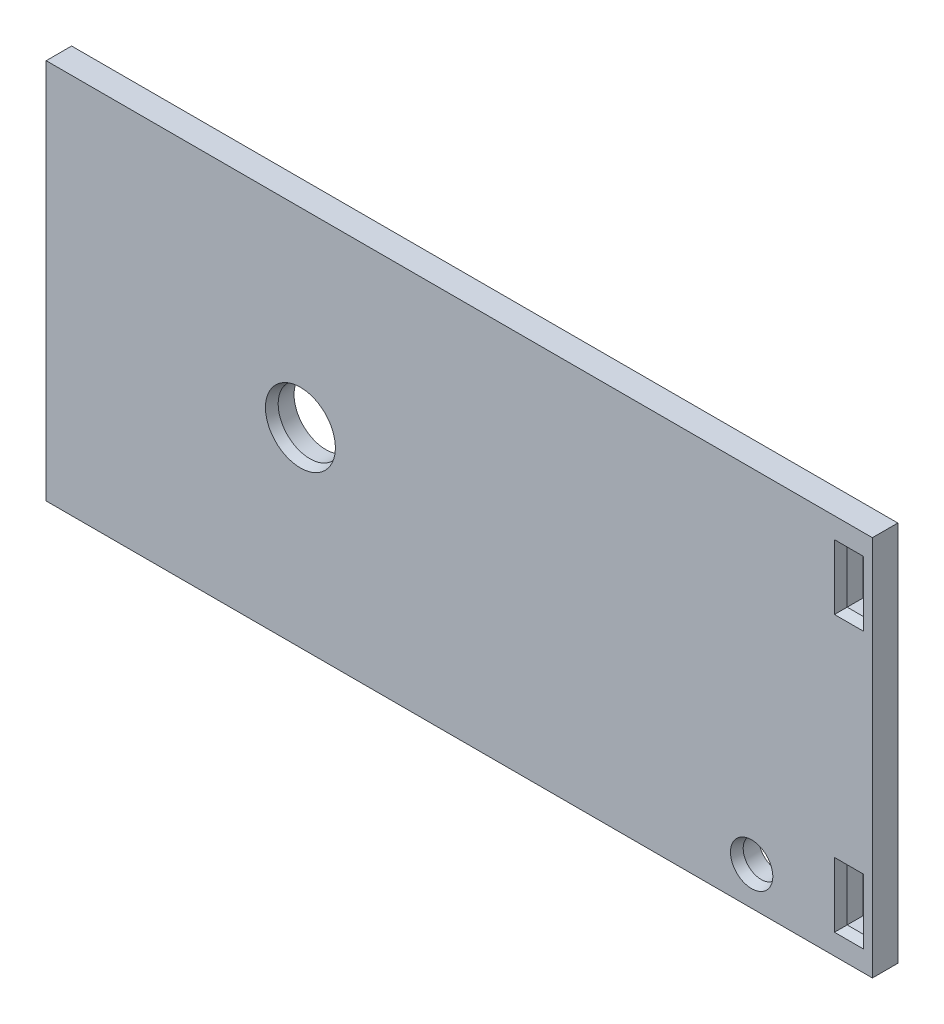
ISO-10303-21;
HEADER;
FILE_DESCRIPTION(('STEP AP214'),'2;1');
FILE_NAME('part.step','',(''),(''),'','','');
FILE_SCHEMA(('AUTOMOTIVE_DESIGN { 1 0 10303 214 1 1 1 1 }'));
ENDSEC;
DATA;
#1=APPLICATION_CONTEXT('core data for automotive mechanical design processes');
#2=APPLICATION_PROTOCOL_DEFINITION('international standard','automotive_design',2000,#1);
#3=PRODUCT_CONTEXT('',#1,'mechanical');
#4=PRODUCT('Part','Part','',(#3));
#5=PRODUCT_RELATED_PRODUCT_CATEGORY('part','',(#4));
#6=PRODUCT_DEFINITION_FORMATION('','',#4);
#7=PRODUCT_DEFINITION_CONTEXT('part definition',#1,'design');
#8=PRODUCT_DEFINITION('design','',#6,#7);
#9=PRODUCT_DEFINITION_SHAPE('','',#8);
#10=(LENGTH_UNIT() NAMED_UNIT(*) SI_UNIT(.MILLI.,.METRE.));
#11=(NAMED_UNIT(*) PLANE_ANGLE_UNIT() SI_UNIT($,.RADIAN.));
#12=(NAMED_UNIT(*) SI_UNIT($,.STERADIAN.) SOLID_ANGLE_UNIT());
#13=UNCERTAINTY_MEASURE_WITH_UNIT(LENGTH_MEASURE(1.E-05),#10,'distance_accuracy_value','');
#14=(GEOMETRIC_REPRESENTATION_CONTEXT(3) GLOBAL_UNCERTAINTY_ASSIGNED_CONTEXT((#13)) GLOBAL_UNIT_ASSIGNED_CONTEXT((#10,
#11,#12)) REPRESENTATION_CONTEXT('',''));
#15=CARTESIAN_POINT('',(0.,0.,0.));
#16=DIRECTION('',(0.,0.,1.));
#17=DIRECTION('',(1.,0.,0.));
#18=AXIS2_PLACEMENT_3D('',#15,#16,#17);
#19=CARTESIAN_POINT('',(0.,0.,2.));
#20=DIRECTION('',(0.,0.,-1.));
#21=DIRECTION('',(-1.,0.,0.));
#22=AXIS2_PLACEMENT_3D('',#19,#20,#21);
#23=PLANE('',#22);
#24=CARTESIAN_POINT('',(-25.,0.,2.));
#25=DIRECTION('',(0.,0.,-1.));
#26=DIRECTION('',(-1.,0.,0.));
#27=AXIS2_PLACEMENT_3D('',#24,#25,#26);
#28=CIRCLE('',#27,5.49999999999996);
#29=CARTESIAN_POINT('',(-30.5,0.,2.));
#30=VERTEX_POINT('',#29);
#31=EDGE_CURVE('E267',#30,#30,#28,.T.);
#32=ORIENTED_EDGE('',*,*,#31,.T.);
#33=EDGE_LOOP('',(#32));
#34=FACE_BOUND('',#33,.T.);
#35=CARTESIAN_POINT('',(46.,-24.,2.));
#36=DIRECTION('',(0.,0.,-1.));
#37=DIRECTION('',(-1.,0.,0.));
#38=AXIS2_PLACEMENT_3D('',#35,#36,#37);
#39=CIRCLE('',#38,3.33000000000002);
#40=CARTESIAN_POINT('',(42.67,-24.,2.));
#41=VERTEX_POINT('',#40);
#42=EDGE_CURVE('E264',#41,#41,#39,.T.);
#43=ORIENTED_EDGE('',*,*,#42,.T.);
#44=EDGE_LOOP('',(#43));
#45=FACE_BOUND('',#44,.T.);
#46=DIRECTION('',(0.,-1.,0.));
#47=VECTOR('',#46,1.);
#48=CARTESIAN_POINT('',(63.565,17.05,2.));
#49=LINE('',#48,#47);
#50=CARTESIAN_POINT('',(63.565,26.75,2.));
#51=VERTEX_POINT('',#50);
#52=CARTESIAN_POINT('',(63.565,16.55,2.));
#53=VERTEX_POINT('',#52);
#54=EDGE_CURVE('E255',#51,#53,#49,.T.);
#55=ORIENTED_EDGE('',*,*,#54,.T.);
#56=DIRECTION('',(-1.,0.,0.));
#57=VECTOR('',#56,1.);
#58=CARTESIAN_POINT('',(59.535,16.55,2.));
#59=LINE('',#58,#57);
#60=CARTESIAN_POINT('',(59.035,16.55,2.));
#61=VERTEX_POINT('',#60);
#62=EDGE_CURVE('E261',#53,#61,#59,.T.);
#63=ORIENTED_EDGE('',*,*,#62,.T.);
#64=DIRECTION('',(0.,1.,0.));
#65=VECTOR('',#64,1.);
#66=CARTESIAN_POINT('',(59.035,26.25,2.));
#67=LINE('',#66,#65);
#68=CARTESIAN_POINT('',(59.035,26.75,2.));
#69=VERTEX_POINT('',#68);
#70=EDGE_CURVE('E259',#61,#69,#67,.T.);
#71=ORIENTED_EDGE('',*,*,#70,.T.);
#72=DIRECTION('',(1.,0.,0.));
#73=VECTOR('',#72,1.);
#74=CARTESIAN_POINT('',(63.065,26.75,2.));
#75=LINE('',#74,#73);
#76=EDGE_CURVE('E257',#69,#51,#75,.T.);
#77=ORIENTED_EDGE('',*,*,#76,.T.);
#78=EDGE_LOOP('',(#55,#63,#71,#77));
#79=FACE_BOUND('',#78,.T.);
#80=DIRECTION('',(1.,0.,0.));
#81=VECTOR('',#80,1.);
#82=CARTESIAN_POINT('',(63.065,-16.55,2.));
#83=LINE('',#82,#81);
#84=CARTESIAN_POINT('',(59.035,-16.55,2.));
#85=VERTEX_POINT('',#84);
#86=CARTESIAN_POINT('',(63.565,-16.55,2.));
#87=VERTEX_POINT('',#86);
#88=EDGE_CURVE('E246',#85,#87,#83,.T.);
#89=ORIENTED_EDGE('',*,*,#88,.T.);
#90=DIRECTION('',(0.,-1.,0.));
#91=VECTOR('',#90,1.);
#92=CARTESIAN_POINT('',(63.565,-26.25,2.));
#93=LINE('',#92,#91);
#94=CARTESIAN_POINT('',(63.565,-26.75,2.));
#95=VERTEX_POINT('',#94);
#96=EDGE_CURVE('E252',#87,#95,#93,.T.);
#97=ORIENTED_EDGE('',*,*,#96,.T.);
#98=DIRECTION('',(-1.,0.,0.));
#99=VECTOR('',#98,1.);
#100=CARTESIAN_POINT('',(59.535,-26.75,2.));
#101=LINE('',#100,#99);
#102=CARTESIAN_POINT('',(59.035,-26.75,2.));
#103=VERTEX_POINT('',#102);
#104=EDGE_CURVE('E250',#95,#103,#101,.T.);
#105=ORIENTED_EDGE('',*,*,#104,.T.);
#106=DIRECTION('',(0.,1.,0.));
#107=VECTOR('',#106,1.);
#108=CARTESIAN_POINT('',(59.035,-17.05,2.));
#109=LINE('',#108,#107);
#110=EDGE_CURVE('E248',#103,#85,#109,.T.);
#111=ORIENTED_EDGE('',*,*,#110,.T.);
#112=EDGE_LOOP('',(#89,#97,#105,#111));
#113=FACE_BOUND('',#112,.T.);
#114=DIRECTION('',(1.,0.,0.));
#115=VECTOR('',#114,1.);
#116=CARTESIAN_POINT('',(-65.,-30.,2.));
#117=LINE('',#116,#115);
#118=CARTESIAN_POINT('',(-65.,-30.,2.));
#119=VERTEX_POINT('',#118);
#120=CARTESIAN_POINT('',(65.,-30.,2.));
#121=VERTEX_POINT('',#120);
#122=EDGE_CURVE('E214',#119,#121,#117,.T.);
#123=ORIENTED_EDGE('',*,*,#122,.T.);
#124=DIRECTION('',(0.,1.,0.));
#125=VECTOR('',#124,1.);
#126=CARTESIAN_POINT('',(65.,30.,2.));
#127=LINE('',#126,#125);
#128=CARTESIAN_POINT('',(65.,30.,2.));
#129=VERTEX_POINT('',#128);
#130=EDGE_CURVE('E217',#121,#129,#127,.T.);
#131=ORIENTED_EDGE('',*,*,#130,.T.);
#132=DIRECTION('',(-1.,0.,0.));
#133=VECTOR('',#132,1.);
#134=CARTESIAN_POINT('',(-65.,30.,2.));
#135=LINE('',#134,#133);
#136=CARTESIAN_POINT('',(-65.,30.,2.));
#137=VERTEX_POINT('',#136);
#138=EDGE_CURVE('E220',#129,#137,#135,.T.);
#139=ORIENTED_EDGE('',*,*,#138,.T.);
#140=DIRECTION('',(0.,-1.,0.));
#141=VECTOR('',#140,1.);
#142=CARTESIAN_POINT('',(-65.,-30.,2.));
#143=LINE('',#142,#141);
#144=EDGE_CURVE('E222',#137,#119,#143,.T.);
#145=ORIENTED_EDGE('',*,*,#144,.T.);
#146=EDGE_LOOP('',(#123,#131,#139,#145));
#147=FACE_BOUND('',#146,.T.);
#148=ADVANCED_FACE('F34',(#34,#45,#79,#113,#147),#23,.F.);
#149=CARTESIAN_POINT('',(0.,0.,-2.));
#150=DIRECTION('',(0.,0.,-1.));
#151=DIRECTION('',(-1.,0.,0.));
#152=AXIS2_PLACEMENT_3D('',#149,#150,#151);
#153=PLANE('',#152);
#154=CARTESIAN_POINT('',(46.,-24.,-2.));
#155=DIRECTION('',(0.,0.,1.));
#156=DIRECTION('',(1.,0.,0.));
#157=AXIS2_PLACEMENT_3D('',#154,#155,#156);
#158=CIRCLE('',#157,2.83);
#159=CARTESIAN_POINT('',(48.83,-24.,-2.));
#160=VERTEX_POINT('',#159);
#161=EDGE_CURVE('E190',#160,#160,#158,.T.);
#162=ORIENTED_EDGE('',*,*,#161,.T.);
#163=EDGE_LOOP('',(#162));
#164=FACE_BOUND('',#163,.T.);
#165=DIRECTION('',(1.,0.,0.));
#166=VECTOR('',#165,1.);
#167=CARTESIAN_POINT('',(-65.,-30.,-2.));
#168=LINE('',#167,#166);
#169=CARTESIAN_POINT('',(-65.,-30.,-2.));
#170=VERTEX_POINT('',#169);
#171=CARTESIAN_POINT('',(65.,-30.,-2.));
#172=VERTEX_POINT('',#171);
#173=EDGE_CURVE('E213',#170,#172,#168,.T.);
#174=ORIENTED_EDGE('',*,*,#173,.F.);
#175=DIRECTION('',(0.,-1.,0.));
#176=VECTOR('',#175,1.);
#177=CARTESIAN_POINT('',(-65.,-30.,-2.));
#178=LINE('',#177,#176);
#179=CARTESIAN_POINT('',(-65.,30.,-2.));
#180=VERTEX_POINT('',#179);
#181=EDGE_CURVE('E218',#180,#170,#178,.T.);
#182=ORIENTED_EDGE('',*,*,#181,.F.);
#183=DIRECTION('',(-1.,0.,0.));
#184=VECTOR('',#183,1.);
#185=CARTESIAN_POINT('',(-65.,30.,-2.));
#186=LINE('',#185,#184);
#187=CARTESIAN_POINT('',(65.,30.,-2.));
#188=VERTEX_POINT('',#187);
#189=EDGE_CURVE('E229',#188,#180,#186,.T.);
#190=ORIENTED_EDGE('',*,*,#189,.F.);
#191=DIRECTION('',(0.,1.,0.));
#192=VECTOR('',#191,1.);
#193=CARTESIAN_POINT('',(65.,30.,-2.));
#194=LINE('',#193,#192);
#195=EDGE_CURVE('E227',#172,#188,#194,.T.);
#196=ORIENTED_EDGE('',*,*,#195,.F.);
#197=EDGE_LOOP('',(#174,#182,#190,#196));
#198=FACE_BOUND('',#197,.T.);
#199=DIRECTION('',(-1.,0.,0.));
#200=VECTOR('',#199,1.);
#201=CARTESIAN_POINT('',(59.535,-17.05,-2.));
#202=LINE('',#201,#200);
#203=CARTESIAN_POINT('',(63.065,-17.05,-2.));
#204=VERTEX_POINT('',#203);
#205=CARTESIAN_POINT('',(59.535,-17.05,-2.));
#206=VERTEX_POINT('',#205);
#207=EDGE_CURVE('E202',#204,#206,#202,.T.);
#208=ORIENTED_EDGE('',*,*,#207,.T.);
#209=DIRECTION('',(0.,-1.,0.));
#210=VECTOR('',#209,1.);
#211=CARTESIAN_POINT('',(59.535,-17.05,-2.));
#212=LINE('',#211,#210);
#213=CARTESIAN_POINT('',(59.535,-26.25,-2.));
#214=VERTEX_POINT('',#213);
#215=EDGE_CURVE('E193',#206,#214,#212,.T.);
#216=ORIENTED_EDGE('',*,*,#215,.T.);
#217=DIRECTION('',(1.,0.,0.));
#218=VECTOR('',#217,1.);
#219=CARTESIAN_POINT('',(59.535,-26.25,-2.));
#220=LINE('',#219,#218);
#221=CARTESIAN_POINT('',(63.065,-26.25,-2.));
#222=VERTEX_POINT('',#221);
#223=EDGE_CURVE('E196',#214,#222,#220,.T.);
#224=ORIENTED_EDGE('',*,*,#223,.T.);
#225=DIRECTION('',(0.,1.,0.));
#226=VECTOR('',#225,1.);
#227=CARTESIAN_POINT('',(63.065,-17.05,-2.));
#228=LINE('',#227,#226);
#229=EDGE_CURVE('E199',#222,#204,#228,.T.);
#230=ORIENTED_EDGE('',*,*,#229,.T.);
#231=EDGE_LOOP('',(#208,#216,#224,#230));
#232=FACE_BOUND('',#231,.T.);
#233=CARTESIAN_POINT('',(-25.,0.,-2.));
#234=DIRECTION('',(0.,0.,1.));
#235=DIRECTION('',(1.,0.,0.));
#236=AXIS2_PLACEMENT_3D('',#233,#234,#235);
#237=CIRCLE('',#236,5.);
#238=CARTESIAN_POINT('',(-20.,0.,-2.));
#239=VERTEX_POINT('',#238);
#240=EDGE_CURVE('E160',#239,#239,#237,.T.);
#241=ORIENTED_EDGE('',*,*,#240,.T.);
#242=EDGE_LOOP('',(#241));
#243=FACE_BOUND('',#242,.T.);
#244=DIRECTION('',(-1.,0.,0.));
#245=VECTOR('',#244,1.);
#246=CARTESIAN_POINT('',(59.535,26.25,-2.));
#247=LINE('',#246,#245);
#248=CARTESIAN_POINT('',(63.065,26.25,-2.));
#249=VERTEX_POINT('',#248);
#250=CARTESIAN_POINT('',(59.535,26.25,-2.));
#251=VERTEX_POINT('',#250);
#252=EDGE_CURVE('E174',#249,#251,#247,.T.);
#253=ORIENTED_EDGE('',*,*,#252,.T.);
#254=DIRECTION('',(0.,-1.,0.));
#255=VECTOR('',#254,1.);
#256=CARTESIAN_POINT('',(59.535,26.25,-2.));
#257=LINE('',#256,#255);
#258=CARTESIAN_POINT('',(59.535,17.05,-2.));
#259=VERTEX_POINT('',#258);
#260=EDGE_CURVE('E153',#251,#259,#257,.T.);
#261=ORIENTED_EDGE('',*,*,#260,.T.);
#262=DIRECTION('',(1.,0.,0.));
#263=VECTOR('',#262,1.);
#264=CARTESIAN_POINT('',(59.535,17.05,-2.));
#265=LINE('',#264,#263);
#266=CARTESIAN_POINT('',(63.065,17.05,-2.));
#267=VERTEX_POINT('',#266);
#268=EDGE_CURVE('E164',#259,#267,#265,.T.);
#269=ORIENTED_EDGE('',*,*,#268,.T.);
#270=DIRECTION('',(0.,1.,0.));
#271=VECTOR('',#270,1.);
#272=CARTESIAN_POINT('',(63.065,26.25,-2.));
#273=LINE('',#272,#271);
#274=EDGE_CURVE('E170',#267,#249,#273,.T.);
#275=ORIENTED_EDGE('',*,*,#274,.T.);
#276=EDGE_LOOP('',(#253,#261,#269,#275));
#277=FACE_BOUND('',#276,.T.);
#278=ADVANCED_FACE('F172',(#164,#198,#232,#243,#277),#153,.T.);
#279=CARTESIAN_POINT('',(-65.,-30.,2.));
#280=DIRECTION('',(0.,1.,0.));
#281=DIRECTION('',(0.,0.,1.));
#282=AXIS2_PLACEMENT_3D('',#279,#280,#281);
#283=PLANE('',#282);
#284=ORIENTED_EDGE('',*,*,#173,.T.);
#285=DIRECTION('',(0.,0.,-1.));
#286=VECTOR('',#285,1.);
#287=CARTESIAN_POINT('',(65.,-30.,2.));
#288=LINE('',#287,#286);
#289=EDGE_CURVE('E240',#121,#172,#288,.T.);
#290=ORIENTED_EDGE('',*,*,#289,.F.);
#291=ORIENTED_EDGE('',*,*,#122,.F.);
#292=DIRECTION('',(0.,0.,-1.));
#293=VECTOR('',#292,1.);
#294=CARTESIAN_POINT('',(-65.,-30.,2.));
#295=LINE('',#294,#293);
#296=EDGE_CURVE('E224',#119,#170,#295,.T.);
#297=ORIENTED_EDGE('',*,*,#296,.T.);
#298=EDGE_LOOP('',(#284,#290,#291,#297));
#299=FACE_BOUND('',#298,.T.);
#300=ADVANCED_FACE('F347',(#299),#283,.F.);
#301=CARTESIAN_POINT('',(65.,30.,2.));
#302=DIRECTION('',(-1.,0.,0.));
#303=DIRECTION('',(0.,0.,1.));
#304=AXIS2_PLACEMENT_3D('',#301,#302,#303);
#305=PLANE('',#304);
#306=ORIENTED_EDGE('',*,*,#195,.T.);
#307=DIRECTION('',(0.,0.,-1.));
#308=VECTOR('',#307,1.);
#309=CARTESIAN_POINT('',(65.,30.,2.));
#310=LINE('',#309,#308);
#311=EDGE_CURVE('E237',#129,#188,#310,.T.);
#312=ORIENTED_EDGE('',*,*,#311,.F.);
#313=ORIENTED_EDGE('',*,*,#130,.F.);
#314=ORIENTED_EDGE('',*,*,#289,.T.);
#315=EDGE_LOOP('',(#306,#312,#313,#314));
#316=FACE_BOUND('',#315,.T.);
#317=ADVANCED_FACE('F354',(#316),#305,.F.);
#318=CARTESIAN_POINT('',(-65.,30.,2.));
#319=DIRECTION('',(0.,-1.,0.));
#320=DIRECTION('',(0.,0.,-1.));
#321=AXIS2_PLACEMENT_3D('',#318,#319,#320);
#322=PLANE('',#321);
#323=ORIENTED_EDGE('',*,*,#189,.T.);
#324=DIRECTION('',(0.,0.,-1.));
#325=VECTOR('',#324,1.);
#326=CARTESIAN_POINT('',(-65.,30.,2.));
#327=LINE('',#326,#325);
#328=EDGE_CURVE('E234',#137,#180,#327,.T.);
#329=ORIENTED_EDGE('',*,*,#328,.F.);
#330=ORIENTED_EDGE('',*,*,#138,.F.);
#331=ORIENTED_EDGE('',*,*,#311,.T.);
#332=EDGE_LOOP('',(#323,#329,#330,#331));
#333=FACE_BOUND('',#332,.T.);
#334=ADVANCED_FACE('F338',(#333),#322,.F.);
#335=CARTESIAN_POINT('',(-65.,-30.,2.));
#336=DIRECTION('',(1.,0.,0.));
#337=DIRECTION('',(0.,0.,-1.));
#338=AXIS2_PLACEMENT_3D('',#335,#336,#337);
#339=PLANE('',#338);
#340=ORIENTED_EDGE('',*,*,#181,.T.);
#341=ORIENTED_EDGE('',*,*,#296,.F.);
#342=ORIENTED_EDGE('',*,*,#144,.F.);
#343=ORIENTED_EDGE('',*,*,#328,.T.);
#344=EDGE_LOOP('',(#340,#341,#342,#343));
#345=FACE_BOUND('',#344,.T.);
#346=ADVANCED_FACE('F331',(#345),#339,.F.);
#347=CARTESIAN_POINT('',(59.535,-17.05,2.));
#348=DIRECTION('',(1.,0.,0.));
#349=DIRECTION('',(0.,1.,0.));
#350=AXIS2_PLACEMENT_3D('',#347,#348,#349);
#351=PLANE('',#350);
#352=DIRECTION('',(0.,0.,-1.));
#353=VECTOR('',#352,1.);
#354=CARTESIAN_POINT('',(59.535,-17.05,2.));
#355=LINE('',#354,#353);
#356=CARTESIAN_POINT('',(59.535,-17.05,0.499999999999999));
#357=VERTEX_POINT('',#356);
#358=EDGE_CURVE('E205',#357,#206,#355,.T.);
#359=ORIENTED_EDGE('',*,*,#358,.F.);
#360=DIRECTION('',(0.,-1.,0.));
#361=VECTOR('',#360,1.);
#362=CARTESIAN_POINT('',(59.535,-26.25,0.499999999999999));
#363=LINE('',#362,#361);
#364=CARTESIAN_POINT('',(59.535,-26.25,0.499999999999999));
#365=VERTEX_POINT('',#364);
#366=EDGE_CURVE('E44',#357,#365,#363,.T.);
#367=ORIENTED_EDGE('',*,*,#366,.T.);
#368=DIRECTION('',(0.,0.,-1.));
#369=VECTOR('',#368,1.);
#370=CARTESIAN_POINT('',(59.535,-26.25,2.));
#371=LINE('',#370,#369);
#372=EDGE_CURVE('E211',#365,#214,#371,.T.);
#373=ORIENTED_EDGE('',*,*,#372,.T.);
#374=ORIENTED_EDGE('',*,*,#215,.F.);
#375=EDGE_LOOP('',(#359,#367,#373,#374));
#376=FACE_BOUND('',#375,.T.);
#377=ADVANCED_FACE('F329',(#376),#351,.T.);
#378=CARTESIAN_POINT('',(59.535,-26.25,2.));
#379=DIRECTION('',(0.,1.,0.));
#380=DIRECTION('',(0.,0.,1.));
#381=AXIS2_PLACEMENT_3D('',#378,#379,#380);
#382=PLANE('',#381);
#383=ORIENTED_EDGE('',*,*,#372,.F.);
#384=DIRECTION('',(1.,0.,0.));
#385=VECTOR('',#384,1.);
#386=CARTESIAN_POINT('',(63.065,-26.25,0.499999999999999));
#387=LINE('',#386,#385);
#388=CARTESIAN_POINT('',(63.065,-26.25,0.499999999999999));
#389=VERTEX_POINT('',#388);
#390=EDGE_CURVE('E283',#365,#389,#387,.T.);
#391=ORIENTED_EDGE('',*,*,#390,.T.);
#392=DIRECTION('',(0.,0.,-1.));
#393=VECTOR('',#392,1.);
#394=CARTESIAN_POINT('',(63.065,-26.25,2.));
#395=LINE('',#394,#393);
#396=EDGE_CURVE('E209',#389,#222,#395,.T.);
#397=ORIENTED_EDGE('',*,*,#396,.T.);
#398=ORIENTED_EDGE('',*,*,#223,.F.);
#399=EDGE_LOOP('',(#383,#391,#397,#398));
#400=FACE_BOUND('',#399,.T.);
#401=ADVANCED_FACE('F328',(#400),#382,.T.);
#402=CARTESIAN_POINT('',(63.065,-17.05,2.));
#403=DIRECTION('',(-1.,0.,0.));
#404=DIRECTION('',(0.,0.,1.));
#405=AXIS2_PLACEMENT_3D('',#402,#403,#404);
#406=PLANE('',#405);
#407=ORIENTED_EDGE('',*,*,#396,.F.);
#408=DIRECTION('',(0.,1.,0.));
#409=VECTOR('',#408,1.);
#410=CARTESIAN_POINT('',(63.065,-17.05,0.499999999999999));
#411=LINE('',#410,#409);
#412=CARTESIAN_POINT('',(63.065,-17.05,0.499999999999999));
#413=VERTEX_POINT('',#412);
#414=EDGE_CURVE('E280',#389,#413,#411,.T.);
#415=ORIENTED_EDGE('',*,*,#414,.T.);
#416=DIRECTION('',(0.,0.,-1.));
#417=VECTOR('',#416,1.);
#418=CARTESIAN_POINT('',(63.065,-17.05,2.));
#419=LINE('',#418,#417);
#420=EDGE_CURVE('E207',#413,#204,#419,.T.);
#421=ORIENTED_EDGE('',*,*,#420,.T.);
#422=ORIENTED_EDGE('',*,*,#229,.F.);
#423=EDGE_LOOP('',(#407,#415,#421,#422));
#424=FACE_BOUND('',#423,.T.);
#425=ADVANCED_FACE('F319',(#424),#406,.T.);
#426=CARTESIAN_POINT('',(59.535,-17.05,2.));
#427=DIRECTION('',(0.,-1.,0.));
#428=DIRECTION('',(0.,0.,-1.));
#429=AXIS2_PLACEMENT_3D('',#426,#427,#428);
#430=PLANE('',#429);
#431=ORIENTED_EDGE('',*,*,#420,.F.);
#432=DIRECTION('',(-1.,0.,0.));
#433=VECTOR('',#432,1.);
#434=CARTESIAN_POINT('',(59.535,-17.05,0.499999999999999));
#435=LINE('',#434,#433);
#436=EDGE_CURVE('E11',#413,#357,#435,.T.);
#437=ORIENTED_EDGE('',*,*,#436,.T.);
#438=ORIENTED_EDGE('',*,*,#358,.T.);
#439=ORIENTED_EDGE('',*,*,#207,.F.);
#440=EDGE_LOOP('',(#431,#437,#438,#439));
#441=FACE_BOUND('',#440,.T.);
#442=ADVANCED_FACE('F322',(#441),#430,.T.);
#443=CARTESIAN_POINT('',(46.,-24.,2.));
#444=DIRECTION('',(0.,0.,-1.));
#445=DIRECTION('',(-1.,0.,0.));
#446=AXIS2_PLACEMENT_3D('',#443,#444,#445);
#447=CYLINDRICAL_SURFACE('',#446,2.83);
#448=CARTESIAN_POINT('',(46.,-24.,0.499999999999912));
#449=DIRECTION('',(0.,0.,-1.));
#450=DIRECTION('',(-1.,0.,0.));
#451=AXIS2_PLACEMENT_3D('',#448,#449,#450);
#452=CIRCLE('',#451,2.83);
#453=CARTESIAN_POINT('',(43.17,-24.,0.499999999999912));
#454=VERTEX_POINT('',#453);
#455=EDGE_CURVE('E270',#454,#454,#452,.F.);
#456=ORIENTED_EDGE('',*,*,#455,.T.);
#457=EDGE_LOOP('',(#456));
#458=FACE_BOUND('',#457,.T.);
#459=ORIENTED_EDGE('',*,*,#161,.F.);
#460=EDGE_LOOP('',(#459));
#461=FACE_BOUND('',#460,.T.);
#462=ADVANCED_FACE('F481',(#458,#461),#447,.F.);
#463=CARTESIAN_POINT('',(-25.,0.,2.));
#464=DIRECTION('',(0.,0.,-1.));
#465=DIRECTION('',(-1.,0.,0.));
#466=AXIS2_PLACEMENT_3D('',#463,#464,#465);
#467=CYLINDRICAL_SURFACE('',#466,5.);
#468=CARTESIAN_POINT('',(-25.,0.,0.500000000000101));
#469=DIRECTION('',(0.,0.,-1.));
#470=DIRECTION('',(-1.,0.,0.));
#471=AXIS2_PLACEMENT_3D('',#468,#469,#470);
#472=CIRCLE('',#471,5.);
#473=CARTESIAN_POINT('',(-30.,0.,0.500000000000101));
#474=VERTEX_POINT('',#473);
#475=EDGE_CURVE('E243',#474,#474,#472,.F.);
#476=ORIENTED_EDGE('',*,*,#475,.T.);
#477=EDGE_LOOP('',(#476));
#478=FACE_BOUND('',#477,.T.);
#479=ORIENTED_EDGE('',*,*,#240,.F.);
#480=EDGE_LOOP('',(#479));
#481=FACE_BOUND('',#480,.T.);
#482=ADVANCED_FACE('F474',(#478,#481),#467,.F.);
#483=CARTESIAN_POINT('',(59.535,26.25,2.));
#484=DIRECTION('',(1.,0.,0.));
#485=DIRECTION('',(0.,1.,0.));
#486=AXIS2_PLACEMENT_3D('',#483,#484,#485);
#487=PLANE('',#486);
#488=DIRECTION('',(0.,0.,-1.));
#489=VECTOR('',#488,1.);
#490=CARTESIAN_POINT('',(59.535,26.25,2.));
#491=LINE('',#490,#489);
#492=CARTESIAN_POINT('',(59.535,26.25,0.499999999999971));
#493=VERTEX_POINT('',#492);
#494=EDGE_CURVE('E183',#493,#251,#491,.T.);
#495=ORIENTED_EDGE('',*,*,#494,.F.);
#496=DIRECTION('',(0.,-1.,0.));
#497=VECTOR('',#496,1.);
#498=CARTESIAN_POINT('',(59.535,17.05,0.499999999999971));
#499=LINE('',#498,#497);
#500=CARTESIAN_POINT('',(59.535,17.05,0.499999999999971));
#501=VERTEX_POINT('',#500);
#502=EDGE_CURVE('E156',#493,#501,#499,.T.);
#503=ORIENTED_EDGE('',*,*,#502,.T.);
#504=DIRECTION('',(0.,0.,-1.));
#505=VECTOR('',#504,1.);
#506=CARTESIAN_POINT('',(59.535,17.05,2.));
#507=LINE('',#506,#505);
#508=EDGE_CURVE('E148',#501,#259,#507,.T.);
#509=ORIENTED_EDGE('',*,*,#508,.T.);
#510=ORIENTED_EDGE('',*,*,#260,.F.);
#511=EDGE_LOOP('',(#495,#503,#509,#510));
#512=FACE_BOUND('',#511,.T.);
#513=ADVANCED_FACE('F151',(#512),#487,.T.);
#514=CARTESIAN_POINT('',(59.535,17.05,2.));
#515=DIRECTION('',(0.,1.,0.));
#516=DIRECTION('',(0.,0.,1.));
#517=AXIS2_PLACEMENT_3D('',#514,#515,#516);
#518=PLANE('',#517);
#519=ORIENTED_EDGE('',*,*,#508,.F.);
#520=DIRECTION('',(1.,0.,0.));
#521=VECTOR('',#520,1.);
#522=CARTESIAN_POINT('',(63.065,17.05,0.499999999999971));
#523=LINE('',#522,#521);
#524=CARTESIAN_POINT('',(63.065,17.05,0.499999999999971));
#525=VERTEX_POINT('',#524);
#526=EDGE_CURVE('E273',#501,#525,#523,.T.);
#527=ORIENTED_EDGE('',*,*,#526,.T.);
#528=DIRECTION('',(0.,0.,-1.));
#529=VECTOR('',#528,1.);
#530=CARTESIAN_POINT('',(63.065,17.05,2.));
#531=LINE('',#530,#529);
#532=EDGE_CURVE('E161',#525,#267,#531,.T.);
#533=ORIENTED_EDGE('',*,*,#532,.T.);
#534=ORIENTED_EDGE('',*,*,#268,.F.);
#535=EDGE_LOOP('',(#519,#527,#533,#534));
#536=FACE_BOUND('',#535,.T.);
#537=ADVANCED_FACE('F165',(#536),#518,.T.);
#538=CARTESIAN_POINT('',(63.065,26.25,2.));
#539=DIRECTION('',(-1.,0.,0.));
#540=DIRECTION('',(0.,-1.,0.));
#541=AXIS2_PLACEMENT_3D('',#538,#539,#540);
#542=PLANE('',#541);
#543=ORIENTED_EDGE('',*,*,#532,.F.);
#544=DIRECTION('',(0.,1.,0.));
#545=VECTOR('',#544,1.);
#546=CARTESIAN_POINT('',(63.065,26.25,0.499999999999971));
#547=LINE('',#546,#545);
#548=CARTESIAN_POINT('',(63.065,26.25,0.499999999999971));
#549=VERTEX_POINT('',#548);
#550=EDGE_CURVE('E278',#525,#549,#547,.T.);
#551=ORIENTED_EDGE('',*,*,#550,.T.);
#552=DIRECTION('',(0.,0.,-1.));
#553=VECTOR('',#552,1.);
#554=CARTESIAN_POINT('',(63.065,26.25,2.));
#555=LINE('',#554,#553);
#556=EDGE_CURVE('E185',#549,#249,#555,.T.);
#557=ORIENTED_EDGE('',*,*,#556,.T.);
#558=ORIENTED_EDGE('',*,*,#274,.F.);
#559=EDGE_LOOP('',(#543,#551,#557,#558));
#560=FACE_BOUND('',#559,.T.);
#561=ADVANCED_FACE('F453',(#560),#542,.T.);
#562=CARTESIAN_POINT('',(59.535,26.25,2.));
#563=DIRECTION('',(0.,-1.,0.));
#564=DIRECTION('',(0.,0.,-1.));
#565=AXIS2_PLACEMENT_3D('',#562,#563,#564);
#566=PLANE('',#565);
#567=ORIENTED_EDGE('',*,*,#556,.F.);
#568=DIRECTION('',(-1.,0.,0.));
#569=VECTOR('',#568,1.);
#570=CARTESIAN_POINT('',(59.535,26.25,0.499999999999971));
#571=LINE('',#570,#569);
#572=EDGE_CURVE('E276',#549,#493,#571,.T.);
#573=ORIENTED_EDGE('',*,*,#572,.T.);
#574=ORIENTED_EDGE('',*,*,#494,.T.);
#575=ORIENTED_EDGE('',*,*,#252,.F.);
#576=EDGE_LOOP('',(#567,#573,#574,#575));
#577=FACE_BOUND('',#576,.T.);
#578=ADVANCED_FACE('F370',(#577),#566,.T.);
#579=CARTESIAN_POINT('',(-25.,0.,0.500000000000101));
#580=DIRECTION('',(0.,0.,1.));
#581=DIRECTION('',(1.,0.,0.));
#582=AXIS2_PLACEMENT_3D('',#579,#580,#581);
#583=CONICAL_SURFACE('',#582,5.,0.321750554396638);
#584=ORIENTED_EDGE('',*,*,#31,.F.);
#585=EDGE_LOOP('',(#584));
#586=FACE_BOUND('',#585,.T.);
#587=ORIENTED_EDGE('',*,*,#475,.F.);
#588=EDGE_LOOP('',(#587));
#589=FACE_BOUND('',#588,.T.);
#590=ADVANCED_FACE('F363',(#586,#589),#583,.F.);
#591=CARTESIAN_POINT('',(46.,-24.,0.499999999999912));
#592=DIRECTION('',(0.,0.,1.));
#593=DIRECTION('',(1.,0.,0.));
#594=AXIS2_PLACEMENT_3D('',#591,#592,#593);
#595=CONICAL_SURFACE('',#594,2.83,0.321750554396636);
#596=ORIENTED_EDGE('',*,*,#42,.F.);
#597=EDGE_LOOP('',(#596));
#598=FACE_BOUND('',#597,.T.);
#599=ORIENTED_EDGE('',*,*,#455,.F.);
#600=EDGE_LOOP('',(#599));
#601=FACE_BOUND('',#600,.T.);
#602=ADVANCED_FACE('F369',(#598,#601),#595,.F.);
#603=CARTESIAN_POINT('',(59.535,26.25,0.499999999999971));
#604=DIRECTION('',(0.,-0.948683298050516,0.316227766016833));
#605=DIRECTION('',(1.,0.,0.));
#606=AXIS2_PLACEMENT_3D('',#603,#604,#605);
#607=PLANE('',#606);
#608=DIRECTION('',(-0.301511344577758,-0.301511344577759,-0.904534033733294));
#609=VECTOR('',#608,1.);
#610=CARTESIAN_POINT('',(62.7440909090909,25.9290909090909,-0.462727272727292));
#611=LINE('',#610,#609);
#612=EDGE_CURVE('E178',#51,#549,#611,.T.);
#613=ORIENTED_EDGE('',*,*,#612,.F.);
#614=ORIENTED_EDGE('',*,*,#76,.F.);
#615=DIRECTION('',(0.301511344577755,-0.30151134457776,-0.904534033733295));
#616=VECTOR('',#615,1.);
#617=CARTESIAN_POINT('',(59.535,26.25,0.499999999999971));
#618=LINE('',#617,#616);
#619=EDGE_CURVE('E175',#493,#69,#618,.F.);
#620=ORIENTED_EDGE('',*,*,#619,.F.);
#621=ORIENTED_EDGE('',*,*,#572,.F.);
#622=EDGE_LOOP('',(#613,#614,#620,#621));
#623=FACE_BOUND('',#622,.T.);
#624=ADVANCED_FACE('F377',(#623),#607,.T.);
#625=CARTESIAN_POINT('',(59.535,26.25,0.499999999999971));
#626=DIRECTION('',(0.948683298050517,0.,0.316227766016828));
#627=DIRECTION('',(0.,1.,0.));
#628=AXIS2_PLACEMENT_3D('',#625,#626,#627);
#629=PLANE('',#628);
#630=ORIENTED_EDGE('',*,*,#619,.T.);
#631=ORIENTED_EDGE('',*,*,#70,.F.);
#632=DIRECTION('',(0.301511344577755,0.30151134457776,-0.904534033733295));
#633=VECTOR('',#632,1.);
#634=CARTESIAN_POINT('',(59.535,17.05,0.499999999999971));
#635=LINE('',#634,#633);
#636=EDGE_CURVE('E288',#501,#61,#635,.F.);
#637=ORIENTED_EDGE('',*,*,#636,.F.);
#638=ORIENTED_EDGE('',*,*,#502,.F.);
#639=EDGE_LOOP('',(#630,#631,#637,#638));
#640=FACE_BOUND('',#639,.T.);
#641=ADVANCED_FACE('F393',(#640),#629,.T.);
#642=CARTESIAN_POINT('',(63.065,26.25,0.499999999999971));
#643=DIRECTION('',(-0.948683298050516,0.,0.316227766016832));
#644=DIRECTION('',(0.,-1.,0.));
#645=AXIS2_PLACEMENT_3D('',#642,#643,#644);
#646=PLANE('',#645);
#647=ORIENTED_EDGE('',*,*,#612,.T.);
#648=ORIENTED_EDGE('',*,*,#550,.F.);
#649=DIRECTION('',(0.301511344577758,-0.301511344577759,0.904534033733294));
#650=VECTOR('',#649,1.);
#651=CARTESIAN_POINT('',(62.7440909090909,17.3709090909091,-0.462727272727284));
#652=LINE('',#651,#650);
#653=EDGE_CURVE('E286',#53,#525,#652,.F.);
#654=ORIENTED_EDGE('',*,*,#653,.F.);
#655=ORIENTED_EDGE('',*,*,#54,.F.);
#656=EDGE_LOOP('',(#647,#648,#654,#655));
#657=FACE_BOUND('',#656,.T.);
#658=ADVANCED_FACE('F386',(#657),#646,.T.);
#659=CARTESIAN_POINT('',(59.535,17.05,0.499999999999971));
#660=DIRECTION('',(0.,0.948683298050516,0.316227766016833));
#661=DIRECTION('',(-1.,0.,0.));
#662=AXIS2_PLACEMENT_3D('',#659,#660,#661);
#663=PLANE('',#662);
#664=ORIENTED_EDGE('',*,*,#636,.T.);
#665=ORIENTED_EDGE('',*,*,#62,.F.);
#666=ORIENTED_EDGE('',*,*,#653,.T.);
#667=ORIENTED_EDGE('',*,*,#526,.F.);
#668=EDGE_LOOP('',(#664,#665,#666,#667));
#669=FACE_BOUND('',#668,.T.);
#670=ADVANCED_FACE('F380',(#669),#663,.T.);
#671=CARTESIAN_POINT('',(59.535,-17.05,0.499999999999999));
#672=DIRECTION('',(0.948683298050516,0.,0.316227766016832));
#673=DIRECTION('',(0.,1.,0.));
#674=AXIS2_PLACEMENT_3D('',#671,#672,#673);
#675=PLANE('',#674);
#676=DIRECTION('',(0.301511344577758,-0.30151134457776,-0.904534033733294));
#677=VECTOR('',#676,1.);
#678=CARTESIAN_POINT('',(59.535,-17.05,0.499999999999999));
#679=LINE('',#678,#677);
#680=EDGE_CURVE('E295',#85,#357,#679,.T.);
#681=ORIENTED_EDGE('',*,*,#680,.F.);
#682=ORIENTED_EDGE('',*,*,#110,.F.);
#683=DIRECTION('',(0.301511344577759,0.30151134457776,-0.904534033733293));
#684=VECTOR('',#683,1.);
#685=CARTESIAN_POINT('',(59.535,-26.25,0.499999999999999));
#686=LINE('',#685,#684);
#687=EDGE_CURVE('E39',#365,#103,#686,.F.);
#688=ORIENTED_EDGE('',*,*,#687,.F.);
#689=ORIENTED_EDGE('',*,*,#366,.F.);
#690=EDGE_LOOP('',(#681,#682,#688,#689));
#691=FACE_BOUND('',#690,.T.);
#692=ADVANCED_FACE('F37',(#691),#675,.T.);
#693=CARTESIAN_POINT('',(59.535,-26.25,0.499999999999999));
#694=DIRECTION('',(0.,0.948683298050515,0.316227766016834));
#695=DIRECTION('',(-1.,0.,0.));
#696=AXIS2_PLACEMENT_3D('',#693,#694,#695);
#697=PLANE('',#696);
#698=ORIENTED_EDGE('',*,*,#687,.T.);
#699=ORIENTED_EDGE('',*,*,#104,.F.);
#700=DIRECTION('',(-0.301511344577764,0.30151134457776,-0.904534033733292));
#701=VECTOR('',#700,1.);
#702=CARTESIAN_POINT('',(62.2286363636364,-25.4136363636364,-2.00909090909088));
#703=LINE('',#702,#701);
#704=EDGE_CURVE('E294',#389,#95,#703,.F.);
#705=ORIENTED_EDGE('',*,*,#704,.F.);
#706=ORIENTED_EDGE('',*,*,#390,.F.);
#707=EDGE_LOOP('',(#698,#699,#705,#706));
#708=FACE_BOUND('',#707,.T.);
#709=ADVANCED_FACE('F305',(#708),#697,.T.);
#710=CARTESIAN_POINT('',(59.535,-17.05,0.499999999999999));
#711=DIRECTION('',(0.,-0.948683298050515,0.316227766016834));
#712=DIRECTION('',(1.,0.,0.));
#713=AXIS2_PLACEMENT_3D('',#710,#711,#712);
#714=PLANE('',#713);
#715=ORIENTED_EDGE('',*,*,#680,.T.);
#716=ORIENTED_EDGE('',*,*,#436,.F.);
#717=DIRECTION('',(0.301511344577764,0.30151134457776,0.904534033733292));
#718=VECTOR('',#717,1.);
#719=CARTESIAN_POINT('',(63.065,-17.05,0.499999999999999));
#720=LINE('',#719,#718);
#721=EDGE_CURVE('E292',#87,#413,#720,.F.);
#722=ORIENTED_EDGE('',*,*,#721,.F.);
#723=ORIENTED_EDGE('',*,*,#88,.F.);
#724=EDGE_LOOP('',(#715,#716,#722,#723));
#725=FACE_BOUND('',#724,.T.);
#726=ADVANCED_FACE('F316',(#725),#714,.T.);
#727=CARTESIAN_POINT('',(63.065,-17.05,0.499999999999999));
#728=DIRECTION('',(-0.948683298050514,0.,0.316227766016838));
#729=DIRECTION('',(0.,-1.,0.));
#730=AXIS2_PLACEMENT_3D('',#727,#728,#729);
#731=PLANE('',#730);
#732=ORIENTED_EDGE('',*,*,#704,.T.);
#733=ORIENTED_EDGE('',*,*,#96,.F.);
#734=ORIENTED_EDGE('',*,*,#721,.T.);
#735=ORIENTED_EDGE('',*,*,#414,.F.);
#736=EDGE_LOOP('',(#732,#733,#734,#735));
#737=FACE_BOUND('',#736,.T.);
#738=ADVANCED_FACE('F314',(#737),#731,.T.);
#739=CLOSED_SHELL('',(#148,#278,#300,#317,#334,#346,#377,#401,#425,#442,#462,#482,#513,#537,
#561,#578,#590,#602,#624,#641,#658,#670,#692,#709,#726,#738));
#740=MANIFOLD_SOLID_BREP('B2',#739);
#741=ADVANCED_BREP_SHAPE_REPRESENTATION('',(#18,#740),#14);
#742=SHAPE_DEFINITION_REPRESENTATION(#9,#741);
ENDSEC;
END-ISO-10303-21;
